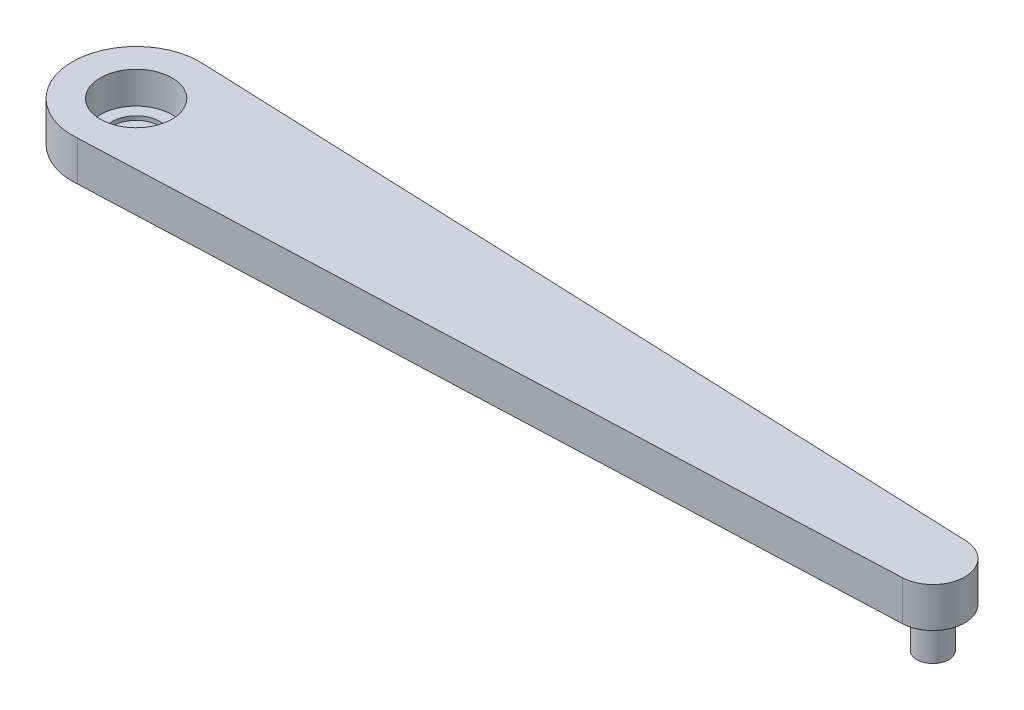
ISO-10303-21;
HEADER;
FILE_DESCRIPTION(('STEP AP214'),'2;1');
FILE_NAME('part.step','',(''),(''),'','','');
FILE_SCHEMA(('AUTOMOTIVE_DESIGN { 1 0 10303 214 1 1 1 1 }'));
ENDSEC;
DATA;
#1=APPLICATION_CONTEXT('core data for automotive mechanical design processes');
#2=APPLICATION_PROTOCOL_DEFINITION('international standard','automotive_design',2000,#1);
#3=PRODUCT_CONTEXT('',#1,'mechanical');
#4=PRODUCT('Part','Part','',(#3));
#5=PRODUCT_RELATED_PRODUCT_CATEGORY('part','',(#4));
#6=PRODUCT_DEFINITION_FORMATION('','',#4);
#7=PRODUCT_DEFINITION_CONTEXT('part definition',#1,'design');
#8=PRODUCT_DEFINITION('design','',#6,#7);
#9=PRODUCT_DEFINITION_SHAPE('','',#8);
#10=(LENGTH_UNIT() NAMED_UNIT(*) SI_UNIT(.MILLI.,.METRE.));
#11=(NAMED_UNIT(*) PLANE_ANGLE_UNIT() SI_UNIT($,.RADIAN.));
#12=(NAMED_UNIT(*) SI_UNIT($,.STERADIAN.) SOLID_ANGLE_UNIT());
#13=UNCERTAINTY_MEASURE_WITH_UNIT(LENGTH_MEASURE(1.E-05),#10,'distance_accuracy_value','');
#14=(GEOMETRIC_REPRESENTATION_CONTEXT(3) GLOBAL_UNCERTAINTY_ASSIGNED_CONTEXT((#13)) GLOBAL_UNIT_ASSIGNED_CONTEXT((#10,
#11,#12)) REPRESENTATION_CONTEXT('',''));
#15=CARTESIAN_POINT('',(0.,0.,0.));
#16=DIRECTION('',(0.,0.,1.));
#17=DIRECTION('',(1.,0.,0.));
#18=AXIS2_PLACEMENT_3D('',#15,#16,#17);
#19=CARTESIAN_POINT('',(100.,-15.,10.9999999999957));
#20=DIRECTION('',(0.,1.,6.0987171194732E-13));
#21=DIRECTION('',(0.,-6.0987171194732E-13,1.));
#22=AXIS2_PLACEMENT_3D('',#19,#20,#21);
#23=CYLINDRICAL_SURFACE('',#22,2.5);
#24=CARTESIAN_POINT('',(100.,-10.,10.9999999999987));
#25=DIRECTION('',(0.,-1.,-6.0987171194732E-13));
#26=DIRECTION('',(0.,6.0987171194732E-13,-1.));
#27=AXIS2_PLACEMENT_3D('',#24,#25,#26);
#28=CIRCLE('',#27,2.5);
#29=CARTESIAN_POINT('',(100.,-9.9999999999985,8.49999999999874));
#30=VERTEX_POINT('',#29);
#31=EDGE_CURVE('E164',#30,#30,#28,.T.);
#32=ORIENTED_EDGE('',*,*,#31,.T.);
#33=EDGE_LOOP('',(#32));
#34=FACE_BOUND('',#33,.T.);
#35=CARTESIAN_POINT('',(100.,-11.,10.9999999999981));
#36=DIRECTION('',(0.,-1.,-6.0987171194732E-13));
#37=DIRECTION('',(0.,6.0987171194732E-13,-1.));
#38=AXIS2_PLACEMENT_3D('',#35,#36,#37);
#39=CIRCLE('',#38,2.49999999999999);
#40=CARTESIAN_POINT('',(100.,-10.9999999999985,8.49999999999813));
#41=VERTEX_POINT('',#40);
#42=EDGE_CURVE('E168',#41,#41,#39,.T.);
#43=ORIENTED_EDGE('',*,*,#42,.F.);
#44=EDGE_LOOP('',(#43));
#45=FACE_BOUND('',#44,.T.);
#46=ADVANCED_FACE('F34',(#34,#45),#23,.T.);
#47=CARTESIAN_POINT('',(0.638194142527764,-9.99999999999516,3.02550068589248));
#48=DIRECTION('',(-0.0399189739987593,-6.09385595457592E-13,0.999202920089251));
#49=DIRECTION('',(-0.999202920089251,0.,-0.0399189739987593));
#50=AXIS2_PLACEMENT_3D('',#47,#48,#49);
#51=PLANE('',#50);
#52=DIRECTION('',(0.999202920089251,0.,0.0399189739987593));
#53=VECTOR('',#52,1.);
#54=CARTESIAN_POINT('',(0.638194142527764,-4.99999999999516,3.02550068589552));
#55=LINE('',#54,#53);
#56=CARTESIAN_POINT('',(0.638194142527761,-4.99999999999516,3.02550068589552));
#57=VERTEX_POINT('',#56);
#58=CARTESIAN_POINT('',(100.159744622753,-4.99999999999758,7.00146803553201));
#59=VERTEX_POINT('',#58);
#60=EDGE_CURVE('E97',#57,#59,#55,.T.);
#61=ORIENTED_EDGE('',*,*,#60,.T.);
#62=DIRECTION('',(0.,1.,6.0987171194732E-13));
#63=VECTOR('',#62,1.);
#64=CARTESIAN_POINT('',(100.159744622753,-9.99999999999758,7.00146803552896));
#65=LINE('',#64,#63);
#66=CARTESIAN_POINT('',(100.159744622753,-9.99999999999758,7.00146803552896));
#67=VERTEX_POINT('',#66);
#68=EDGE_CURVE('E11',#67,#59,#65,.T.);
#69=ORIENTED_EDGE('',*,*,#68,.F.);
#70=DIRECTION('',(0.999202920089251,0.,0.0399189739987593));
#71=VECTOR('',#70,1.);
#72=CARTESIAN_POINT('',(0.638194142527764,-9.99999999999516,3.02550068589248));
#73=LINE('',#72,#71);
#74=CARTESIAN_POINT('',(0.638194142527761,-9.99999999999516,3.02550068589248));
#75=VERTEX_POINT('',#74);
#76=EDGE_CURVE('E82',#75,#67,#73,.T.);
#77=ORIENTED_EDGE('',*,*,#76,.F.);
#78=DIRECTION('',(0.,1.,6.0987171194732E-13));
#79=VECTOR('',#78,1.);
#80=CARTESIAN_POINT('',(0.638194142527761,-9.99999999999516,3.02550068589248));
#81=LINE('',#80,#79);
#82=EDGE_CURVE('E93',#75,#57,#81,.T.);
#83=ORIENTED_EDGE('',*,*,#82,.T.);
#84=EDGE_LOOP('',(#61,#69,#77,#83));
#85=FACE_BOUND('',#84,.T.);
#86=ADVANCED_FACE('F36',(#85),#51,.F.);
#87=CARTESIAN_POINT('',(100.,-10.,10.9999999999987));
#88=DIRECTION('',(0.,1.,6.0987171194732E-13));
#89=DIRECTION('',(-1.,0.,0.));
#90=AXIS2_PLACEMENT_3D('',#87,#88,#89);
#91=CYLINDRICAL_SURFACE('',#90,4.00172165641051);
#92=CARTESIAN_POINT('',(100.,-5.00000000000002,11.0000000000018));
#93=DIRECTION('',(0.,-1.,-6.0987171194732E-13));
#94=DIRECTION('',(1.,0.,0.));
#95=AXIS2_PLACEMENT_3D('',#92,#93,#94);
#96=CIRCLE('',#95,4.00172165641051);
#97=CARTESIAN_POINT('',(100.159744622753,-5.00000000000246,14.9985319644716));
#98=VERTEX_POINT('',#97);
#99=EDGE_CURVE('E87',#59,#98,#96,.T.);
#100=ORIENTED_EDGE('',*,*,#99,.T.);
#101=DIRECTION('',(0.,1.,6.0987171194732E-13));
#102=VECTOR('',#101,1.);
#103=CARTESIAN_POINT('',(100.159744622753,-10.0000000000025,14.9985319644685));
#104=LINE('',#103,#102);
#105=CARTESIAN_POINT('',(100.159744622753,-10.0000000000025,14.9985319644685));
#106=VERTEX_POINT('',#105);
#107=EDGE_CURVE('E43',#106,#98,#104,.T.);
#108=ORIENTED_EDGE('',*,*,#107,.F.);
#109=CARTESIAN_POINT('',(100.,-10.,10.9999999999987));
#110=DIRECTION('',(0.,-1.,-6.0987171194732E-13));
#111=DIRECTION('',(1.,0.,0.));
#112=AXIS2_PLACEMENT_3D('',#109,#110,#111);
#113=CIRCLE('',#112,4.00172165641051);
#114=EDGE_CURVE('E77',#67,#106,#113,.T.);
#115=ORIENTED_EDGE('',*,*,#114,.F.);
#116=ORIENTED_EDGE('',*,*,#68,.T.);
#117=EDGE_LOOP('',(#100,#108,#115,#116));
#118=FACE_BOUND('',#117,.T.);
#119=ADVANCED_FACE('F86',(#118),#91,.T.);
#120=CARTESIAN_POINT('',(0.638194142527764,-10.0000000000049,18.974499314105));
#121=DIRECTION('',(0.0399189739987593,-6.09385595457592E-13,0.999202920089251));
#122=DIRECTION('',(-0.999202920089251,0.,0.0399189739987593));
#123=AXIS2_PLACEMENT_3D('',#120,#121,#122);
#124=PLANE('',#123);
#125=DIRECTION('',(0.999202920089251,0.,-0.0399189739987593));
#126=VECTOR('',#125,1.);
#127=CARTESIAN_POINT('',(0.638194142527764,-5.00000000000489,18.9744993141081));
#128=LINE('',#127,#126);
#129=CARTESIAN_POINT('',(0.638194142527764,-5.00000000000489,18.9744993141081));
#130=VERTEX_POINT('',#129);
#131=EDGE_CURVE('E102',#130,#98,#128,.T.);
#132=ORIENTED_EDGE('',*,*,#131,.F.);
#133=DIRECTION('',(0.,1.,6.0987171194732E-13));
#134=VECTOR('',#133,1.);
#135=CARTESIAN_POINT('',(0.638194142527764,-10.0000000000049,18.974499314105));
#136=LINE('',#135,#134);
#137=CARTESIAN_POINT('',(0.638194142527764,-10.0000000000049,18.974499314105));
#138=VERTEX_POINT('',#137);
#139=EDGE_CURVE('E67',#138,#130,#136,.T.);
#140=ORIENTED_EDGE('',*,*,#139,.F.);
#141=DIRECTION('',(0.999202920089251,0.,-0.0399189739987593));
#142=VECTOR('',#141,1.);
#143=CARTESIAN_POINT('',(0.638194142527764,-10.0000000000049,18.974499314105));
#144=LINE('',#143,#142);
#145=EDGE_CURVE('E80',#138,#106,#144,.T.);
#146=ORIENTED_EDGE('',*,*,#145,.T.);
#147=ORIENTED_EDGE('',*,*,#107,.T.);
#148=EDGE_LOOP('',(#132,#140,#146,#147));
#149=FACE_BOUND('',#148,.T.);
#150=ADVANCED_FACE('F91',(#149),#124,.T.);
#151=CARTESIAN_POINT('',(0.,-10.,10.9999999999987));
#152=DIRECTION('',(0.,1.,6.0987171194732E-13));
#153=DIRECTION('',(-1.,0.,0.));
#154=AXIS2_PLACEMENT_3D('',#151,#152,#153);
#155=CYLINDRICAL_SURFACE('',#154,7.99999569213872);
#156=CARTESIAN_POINT('',(0.,-5.00000000000002,11.0000000000018));
#157=DIRECTION('',(0.,-1.,-6.0987171194732E-13));
#158=DIRECTION('',(1.,0.,0.));
#159=AXIS2_PLACEMENT_3D('',#156,#157,#158);
#160=CIRCLE('',#159,7.99999569213872);
#161=EDGE_CURVE('E70',#130,#57,#160,.T.);
#162=ORIENTED_EDGE('',*,*,#161,.T.);
#163=ORIENTED_EDGE('',*,*,#82,.F.);
#164=CARTESIAN_POINT('',(0.,-10.,10.9999999999987));
#165=DIRECTION('',(0.,-1.,-6.0987171194732E-13));
#166=DIRECTION('',(1.,0.,0.));
#167=AXIS2_PLACEMENT_3D('',#164,#165,#166);
#168=CIRCLE('',#167,7.99999569213872);
#169=EDGE_CURVE('E51',#138,#75,#168,.T.);
#170=ORIENTED_EDGE('',*,*,#169,.F.);
#171=ORIENTED_EDGE('',*,*,#139,.T.);
#172=EDGE_LOOP('',(#162,#163,#170,#171));
#173=FACE_BOUND('',#172,.T.);
#174=ADVANCED_FACE('F121',(#173),#155,.T.);
#175=CARTESIAN_POINT('',(100.,-10.,10.9999999999987));
#176=DIRECTION('',(0.,-1.,-6.0987171194732E-13));
#177=DIRECTION('',(1.,0.,0.));
#178=AXIS2_PLACEMENT_3D('',#175,#176,#177);
#179=PLANE('',#178);
#180=ORIENTED_EDGE('',*,*,#31,.F.);
#181=EDGE_LOOP('',(#180));
#182=FACE_BOUND('',#181,.T.);
#183=ORIENTED_EDGE('',*,*,#76,.T.);
#184=ORIENTED_EDGE('',*,*,#114,.T.);
#185=ORIENTED_EDGE('',*,*,#145,.F.);
#186=ORIENTED_EDGE('',*,*,#169,.T.);
#187=EDGE_LOOP('',(#183,#184,#185,#186));
#188=FACE_BOUND('',#187,.T.);
#189=ADVANCED_FACE('F78',(#182,#188),#179,.T.);
#190=CARTESIAN_POINT('',(100.,-5.00000000000002,11.0000000000018));
#191=DIRECTION('',(0.,-1.,-6.0987171194732E-13));
#192=DIRECTION('',(1.,0.,0.));
#193=AXIS2_PLACEMENT_3D('',#190,#191,#192);
#194=PLANE('',#193);
#195=CARTESIAN_POINT('',(0.,-5.00000000000002,11.0000000000018));
#196=DIRECTION('',(0.,1.,6.0987171194732E-13));
#197=DIRECTION('',(-1.,0.,0.));
#198=AXIS2_PLACEMENT_3D('',#195,#196,#197);
#199=CIRCLE('',#198,4.5);
#200=CARTESIAN_POINT('',(-4.5,-5.00000000000002,11.0000000000018));
#201=VERTEX_POINT('',#200);
#202=EDGE_CURVE('E157',#201,#201,#199,.T.);
#203=ORIENTED_EDGE('',*,*,#202,.F.);
#204=EDGE_LOOP('',(#203));
#205=FACE_BOUND('',#204,.T.);
#206=ORIENTED_EDGE('',*,*,#60,.F.);
#207=ORIENTED_EDGE('',*,*,#161,.F.);
#208=ORIENTED_EDGE('',*,*,#131,.T.);
#209=ORIENTED_EDGE('',*,*,#99,.F.);
#210=EDGE_LOOP('',(#206,#207,#208,#209));
#211=FACE_BOUND('',#210,.T.);
#212=ADVANCED_FACE('F109',(#205,#211),#194,.F.);
#213=CARTESIAN_POINT('',(0.,-9.00000000000002,10.9999999999993));
#214=DIRECTION('',(0.,1.,6.0987171194732E-13));
#215=DIRECTION('',(-1.,0.,0.));
#216=AXIS2_PLACEMENT_3D('',#213,#214,#215);
#217=CYLINDRICAL_SURFACE('',#216,4.5);
#218=CARTESIAN_POINT('',(0.,-9.00000000000002,10.9999999999993));
#219=DIRECTION('',(0.,1.,6.0987171194732E-13));
#220=DIRECTION('',(-1.,0.,0.));
#221=AXIS2_PLACEMENT_3D('',#218,#219,#220);
#222=CIRCLE('',#221,4.5);
#223=CARTESIAN_POINT('',(-4.5,-9.00000000000002,10.9999999999993));
#224=VERTEX_POINT('',#223);
#225=EDGE_CURVE('E100',#224,#224,#222,.T.);
#226=CARTESIAN_POINT('',(-4.5,-9.00000000000002,10.9999999999993));
#227=CARTESIAN_POINT('',(-4.5,-8.95833333333336,10.9999999999994));
#228=CARTESIAN_POINT('',(-4.5,-8.91666666666669,10.9999999999994));
#229=CARTESIAN_POINT('',(-4.5,-8.83333333333336,10.9999999999994));
#230=CARTESIAN_POINT('',(-4.5,-8.79166666666669,10.9999999999995));
#231=CARTESIAN_POINT('',(-4.5,-8.70833333333336,10.9999999999995));
#232=CARTESIAN_POINT('',(-4.5,-8.66666666666669,10.9999999999996));
#233=CARTESIAN_POINT('',(-4.5,-8.58333333333336,10.9999999999996));
#234=CARTESIAN_POINT('',(-4.5,-8.54166666666669,10.9999999999996));
#235=CARTESIAN_POINT('',(-4.5,-8.45833333333336,10.9999999999997));
#236=CARTESIAN_POINT('',(-4.5,-8.41666666666669,10.9999999999997));
#237=CARTESIAN_POINT('',(-4.5,-8.33333333333336,10.9999999999998));
#238=CARTESIAN_POINT('',(-4.5,-8.29166666666669,10.9999999999998));
#239=CARTESIAN_POINT('',(-4.5,-8.20833333333336,10.9999999999998));
#240=CARTESIAN_POINT('',(-4.5,-8.16666666666669,10.9999999999999));
#241=CARTESIAN_POINT('',(-4.5,-8.08333333333336,10.9999999999999));
#242=CARTESIAN_POINT('',(-4.5,-8.04166666666669,10.9999999999999));
#243=CARTESIAN_POINT('',(-4.5,-7.95833333333336,11.));
#244=CARTESIAN_POINT('',(-4.5,-7.91666666666669,11.));
#245=CARTESIAN_POINT('',(-4.5,-7.83333333333336,11.0000000000001));
#246=CARTESIAN_POINT('',(-4.5,-7.79166666666669,11.0000000000001));
#247=CARTESIAN_POINT('',(-4.5,-7.70833333333336,11.0000000000001));
#248=CARTESIAN_POINT('',(-4.5,-7.66666666666669,11.0000000000002));
#249=CARTESIAN_POINT('',(-4.5,-7.58333333333336,11.0000000000002));
#250=CARTESIAN_POINT('',(-4.5,-7.54166666666669,11.0000000000002));
#251=CARTESIAN_POINT('',(-4.5,-7.45833333333336,11.0000000000003));
#252=CARTESIAN_POINT('',(-4.5,-7.41666666666669,11.0000000000003));
#253=CARTESIAN_POINT('',(-4.5,-7.33333333333336,11.0000000000004));
#254=CARTESIAN_POINT('',(-4.5,-7.29166666666669,11.0000000000004));
#255=CARTESIAN_POINT('',(-4.5,-7.20833333333336,11.0000000000004));
#256=CARTESIAN_POINT('',(-4.5,-7.16666666666669,11.0000000000005));
#257=CARTESIAN_POINT('',(-4.5,-7.08333333333336,11.0000000000005));
#258=CARTESIAN_POINT('',(-4.5,-7.04166666666669,11.0000000000005));
#259=CARTESIAN_POINT('',(-4.5,-6.95833333333336,11.0000000000006));
#260=CARTESIAN_POINT('',(-4.5,-6.91666666666669,11.0000000000006));
#261=CARTESIAN_POINT('',(-4.5,-6.83333333333336,11.0000000000007));
#262=CARTESIAN_POINT('',(-4.5,-6.79166666666669,11.0000000000007));
#263=CARTESIAN_POINT('',(-4.5,-6.70833333333336,11.0000000000007));
#264=CARTESIAN_POINT('',(-4.5,-6.66666666666669,11.0000000000008));
#265=CARTESIAN_POINT('',(-4.5,-6.58333333333336,11.0000000000008));
#266=CARTESIAN_POINT('',(-4.5,-6.54166666666669,11.0000000000008));
#267=CARTESIAN_POINT('',(-4.5,-6.45833333333336,11.0000000000009));
#268=CARTESIAN_POINT('',(-4.5,-6.41666666666669,11.0000000000009));
#269=CARTESIAN_POINT('',(-4.5,-6.33333333333336,11.000000000001));
#270=CARTESIAN_POINT('',(-4.5,-6.29166666666669,11.000000000001));
#271=CARTESIAN_POINT('',(-4.5,-6.20833333333336,11.000000000001));
#272=CARTESIAN_POINT('',(-4.5,-6.16666666666669,11.0000000000011));
#273=CARTESIAN_POINT('',(-4.5,-6.08333333333336,11.0000000000011));
#274=CARTESIAN_POINT('',(-4.5,-6.04166666666669,11.0000000000012));
#275=CARTESIAN_POINT('',(-4.5,-5.95833333333336,11.0000000000012));
#276=CARTESIAN_POINT('',(-4.5,-5.91666666666669,11.0000000000012));
#277=CARTESIAN_POINT('',(-4.5,-5.83333333333336,11.0000000000013));
#278=CARTESIAN_POINT('',(-4.5,-5.79166666666669,11.0000000000013));
#279=CARTESIAN_POINT('',(-4.5,-5.70833333333336,11.0000000000014));
#280=CARTESIAN_POINT('',(-4.5,-5.66666666666669,11.0000000000014));
#281=CARTESIAN_POINT('',(-4.5,-5.58333333333336,11.0000000000014));
#282=CARTESIAN_POINT('',(-4.5,-5.54166666666669,11.0000000000015));
#283=CARTESIAN_POINT('',(-4.5,-5.45833333333336,11.0000000000015));
#284=CARTESIAN_POINT('',(-4.5,-5.41666666666669,11.0000000000015));
#285=CARTESIAN_POINT('',(-4.5,-5.33333333333336,11.0000000000016));
#286=CARTESIAN_POINT('',(-4.5,-5.29166666666669,11.0000000000016));
#287=CARTESIAN_POINT('',(-4.5,-5.20833333333336,11.0000000000017));
#288=CARTESIAN_POINT('',(-4.5,-5.16666666666669,11.0000000000017));
#289=CARTESIAN_POINT('',(-4.5,-5.08333333333336,11.0000000000017));
#290=CARTESIAN_POINT('',(-4.5,-5.04166666666669,11.0000000000018));
#291=CARTESIAN_POINT('',(-4.5,-5.00000000000002,11.0000000000018));
#292=B_SPLINE_CURVE_WITH_KNOTS('',3,(#226,#227,#228,#229,#230,#231,#232,#233,#234,#235,#236,
#237,#238,#239,#240,#241,#242,#243,#244,#245,#246,#247,#248,#249,#250,#251,#252,#253,#254,#255,
#256,#257,#258,#259,#260,#261,#262,#263,#264,#265,#266,#267,#268,#269,#270,#271,#272,#273,#274,
#275,#276,#277,#278,#279,#280,#281,#282,#283,#284,#285,#286,#287,#288,#289,#290,#291),
.UNSPECIFIED.,.F.,.F.,(4,2,2,2,2,2,2,2,2,2,2,2,2,2,2,2,2,2,2,2,2,2,2,2,2,2,2,2,2,2,2,2,4),(0.,
0.124999999999998,0.249999999999999,0.374999999999999,0.499999999999999,0.624999999999999,
0.749999999999999,0.874999999999999,0.999999999999999,1.125,1.25,1.375,1.5,1.625,1.75,1.875,2.,
2.125,2.25,2.375,2.5,2.625,2.75,2.875,3.,3.125,3.25,3.375,3.5,3.625,3.75,3.875,4.),.UNSPECIFIED.);
#293=EDGE_CURVE('BSEAM111',#224,#201,#292,.T.);
#294=ORIENTED_EDGE('',*,*,#225,.F.);
#295=ORIENTED_EDGE('',*,*,#202,.T.);
#296=ORIENTED_EDGE('',*,*,#293,.T.);
#297=ORIENTED_EDGE('',*,*,#293,.F.);
#298=EDGE_LOOP('',(#294,#296,#295,#297));
#299=FACE_BOUND('',#298,.T.);
#300=ADVANCED_FACE('F111',(#299),#217,.F.);
#301=CARTESIAN_POINT('',(0.,-9.00000000000002,10.9999999999993));
#302=DIRECTION('',(0.,1.,6.0987171194732E-13));
#303=DIRECTION('',(-1.,0.,0.));
#304=AXIS2_PLACEMENT_3D('',#301,#302,#303);
#305=PLANE('',#304);
#306=CARTESIAN_POINT('',(0.,-9.00000000000002,10.9999999999993));
#307=DIRECTION('',(0.,1.,6.0987171194732E-13));
#308=DIRECTION('',(-1.,0.,0.));
#309=AXIS2_PLACEMENT_3D('',#306,#307,#308);
#310=CIRCLE('',#309,3.);
#311=CARTESIAN_POINT('',(-3.,-9.00000000000002,10.9999999999993));
#312=VERTEX_POINT('',#311);
#313=EDGE_CURVE('E154',#312,#312,#310,.T.);
#314=ORIENTED_EDGE('',*,*,#313,.F.);
#315=EDGE_LOOP('',(#314));
#316=FACE_BOUND('',#315,.T.);
#317=ORIENTED_EDGE('',*,*,#225,.T.);
#318=EDGE_LOOP('',(#317));
#319=FACE_BOUND('',#318,.T.);
#320=ADVANCED_FACE('F118',(#316,#319),#305,.T.);
#321=CARTESIAN_POINT('',(0.,-9.50000000000002,10.999999999999));
#322=DIRECTION('',(0.,1.,6.0987171194732E-13));
#323=DIRECTION('',(-1.,0.,0.));
#324=AXIS2_PLACEMENT_3D('',#321,#322,#323);
#325=CYLINDRICAL_SURFACE('',#324,3.);
#326=CARTESIAN_POINT('',(0.,-9.50000000000002,10.999999999999));
#327=DIRECTION('',(0.,1.,6.0987171194732E-13));
#328=DIRECTION('',(-1.,0.,0.));
#329=AXIS2_PLACEMENT_3D('',#326,#327,#328);
#330=CIRCLE('',#329,3.);
#331=CARTESIAN_POINT('',(-3.,-9.50000000000002,10.999999999999));
#332=VERTEX_POINT('',#331);
#333=EDGE_CURVE('E160',#332,#332,#330,.T.);
#334=CARTESIAN_POINT('',(-3.,-9.50000000000002,10.999999999999));
#335=CARTESIAN_POINT('',(-3.,-9.49479166666669,10.999999999999));
#336=CARTESIAN_POINT('',(-3.,-9.48958333333336,10.999999999999));
#337=CARTESIAN_POINT('',(-3.,-9.47916666666669,10.9999999999991));
#338=CARTESIAN_POINT('',(-3.,-9.47395833333336,10.9999999999991));
#339=CARTESIAN_POINT('',(-3.,-9.46354166666669,10.9999999999991));
#340=CARTESIAN_POINT('',(-3.,-9.45833333333336,10.9999999999991));
#341=CARTESIAN_POINT('',(-3.,-9.44791666666669,10.9999999999991));
#342=CARTESIAN_POINT('',(-3.,-9.44270833333336,10.9999999999991));
#343=CARTESIAN_POINT('',(-3.,-9.43229166666669,10.9999999999991));
#344=CARTESIAN_POINT('',(-3.,-9.42708333333336,10.9999999999991));
#345=CARTESIAN_POINT('',(-3.,-9.41666666666669,10.9999999999991));
#346=CARTESIAN_POINT('',(-3.,-9.41145833333336,10.9999999999991));
#347=CARTESIAN_POINT('',(-3.,-9.40104166666669,10.9999999999991));
#348=CARTESIAN_POINT('',(-3.,-9.39583333333336,10.9999999999991));
#349=CARTESIAN_POINT('',(-3.,-9.38541666666669,10.9999999999991));
#350=CARTESIAN_POINT('',(-3.,-9.38020833333336,10.9999999999991));
#351=CARTESIAN_POINT('',(-3.,-9.36979166666669,10.9999999999991));
#352=CARTESIAN_POINT('',(-3.,-9.36458333333336,10.9999999999991));
#353=CARTESIAN_POINT('',(-3.,-9.35416666666669,10.9999999999991));
#354=CARTESIAN_POINT('',(-3.,-9.34895833333336,10.9999999999991));
#355=CARTESIAN_POINT('',(-3.,-9.33854166666669,10.9999999999991));
#356=CARTESIAN_POINT('',(-3.,-9.33333333333336,10.9999999999991));
#357=CARTESIAN_POINT('',(-3.,-9.32291666666669,10.9999999999991));
#358=CARTESIAN_POINT('',(-3.,-9.31770833333336,10.9999999999992));
#359=CARTESIAN_POINT('',(-3.,-9.30729166666669,10.9999999999992));
#360=CARTESIAN_POINT('',(-3.,-9.30208333333336,10.9999999999992));
#361=CARTESIAN_POINT('',(-3.,-9.29166666666669,10.9999999999992));
#362=CARTESIAN_POINT('',(-3.,-9.28645833333336,10.9999999999992));
#363=CARTESIAN_POINT('',(-3.,-9.27604166666669,10.9999999999992));
#364=CARTESIAN_POINT('',(-3.,-9.27083333333336,10.9999999999992));
#365=CARTESIAN_POINT('',(-3.,-9.26041666666669,10.9999999999992));
#366=CARTESIAN_POINT('',(-3.,-9.25520833333336,10.9999999999992));
#367=CARTESIAN_POINT('',(-3.,-9.24479166666669,10.9999999999992));
#368=CARTESIAN_POINT('',(-3.,-9.23958333333336,10.9999999999992));
#369=CARTESIAN_POINT('',(-3.,-9.22916666666669,10.9999999999992));
#370=CARTESIAN_POINT('',(-3.,-9.22395833333336,10.9999999999992));
#371=CARTESIAN_POINT('',(-3.,-9.21354166666669,10.9999999999992));
#372=CARTESIAN_POINT('',(-3.,-9.20833333333336,10.9999999999992));
#373=CARTESIAN_POINT('',(-3.,-9.19791666666669,10.9999999999992));
#374=CARTESIAN_POINT('',(-3.,-9.19270833333336,10.9999999999992));
#375=CARTESIAN_POINT('',(-3.,-9.18229166666669,10.9999999999992));
#376=CARTESIAN_POINT('',(-3.,-9.17708333333336,10.9999999999992));
#377=CARTESIAN_POINT('',(-3.,-9.16666666666669,10.9999999999992));
#378=CARTESIAN_POINT('',(-3.,-9.16145833333336,10.9999999999992));
#379=CARTESIAN_POINT('',(-3.,-9.15104166666669,10.9999999999993));
#380=CARTESIAN_POINT('',(-3.,-9.14583333333336,10.9999999999993));
#381=CARTESIAN_POINT('',(-3.,-9.13541666666669,10.9999999999993));
#382=CARTESIAN_POINT('',(-3.,-9.13020833333336,10.9999999999993));
#383=CARTESIAN_POINT('',(-3.,-9.11979166666669,10.9999999999993));
#384=CARTESIAN_POINT('',(-3.,-9.11458333333336,10.9999999999993));
#385=CARTESIAN_POINT('',(-3.,-9.10416666666669,10.9999999999993));
#386=CARTESIAN_POINT('',(-3.,-9.09895833333336,10.9999999999993));
#387=CARTESIAN_POINT('',(-3.,-9.08854166666669,10.9999999999993));
#388=CARTESIAN_POINT('',(-3.,-9.08333333333336,10.9999999999993));
#389=CARTESIAN_POINT('',(-3.,-9.07291666666669,10.9999999999993));
#390=CARTESIAN_POINT('',(-3.,-9.06770833333336,10.9999999999993));
#391=CARTESIAN_POINT('',(-3.,-9.05729166666669,10.9999999999993));
#392=CARTESIAN_POINT('',(-3.,-9.05208333333336,10.9999999999993));
#393=CARTESIAN_POINT('',(-3.,-9.04166666666669,10.9999999999993));
#394=CARTESIAN_POINT('',(-3.,-9.03645833333336,10.9999999999993));
#395=CARTESIAN_POINT('',(-3.,-9.02604166666669,10.9999999999993));
#396=CARTESIAN_POINT('',(-3.,-9.02083333333336,10.9999999999993));
#397=CARTESIAN_POINT('',(-3.,-9.01041666666669,10.9999999999993));
#398=CARTESIAN_POINT('',(-3.,-9.00520833333336,10.9999999999993));
#399=CARTESIAN_POINT('',(-3.,-9.00000000000002,10.9999999999993));
#400=B_SPLINE_CURVE_WITH_KNOTS('',3,(#334,#335,#336,#337,#338,#339,#340,#341,#342,#343,#344,
#345,#346,#347,#348,#349,#350,#351,#352,#353,#354,#355,#356,#357,#358,#359,#360,#361,#362,#363,
#364,#365,#366,#367,#368,#369,#370,#371,#372,#373,#374,#375,#376,#377,#378,#379,#380,#381,#382,
#383,#384,#385,#386,#387,#388,#389,#390,#391,#392,#393,#394,#395,#396,#397,#398,#399),
.UNSPECIFIED.,.F.,.F.,(4,2,2,2,2,2,2,2,2,2,2,2,2,2,2,2,2,2,2,2,2,2,2,2,2,2,2,2,2,2,2,2,4),(0.,
0.0156249999999983,0.0312499999999983,0.0468749999999983,0.0624999999999983,0.0781249999999983,
0.0937499999999983,0.109374999999998,0.124999999999998,0.140624999999998,0.156249999999998,
0.171874999999998,0.187499999999998,0.203124999999998,0.218749999999998,0.234374999999998,
0.249999999999999,0.265624999999999,0.281249999999999,0.296874999999999,0.312499999999999,
0.328124999999999,0.343749999999999,0.359374999999999,0.374999999999999,0.390624999999999,
0.406249999999999,0.421874999999999,0.437499999999999,0.453124999999999,0.468749999999999,
0.484374999999999,0.499999999999999),.UNSPECIFIED.);
#401=EDGE_CURVE('BSEAM142',#332,#312,#400,.T.);
#402=ORIENTED_EDGE('',*,*,#333,.F.);
#403=ORIENTED_EDGE('',*,*,#313,.T.);
#404=ORIENTED_EDGE('',*,*,#401,.T.);
#405=ORIENTED_EDGE('',*,*,#401,.F.);
#406=EDGE_LOOP('',(#402,#404,#403,#405));
#407=FACE_BOUND('',#406,.T.);
#408=ADVANCED_FACE('F142',(#407),#325,.F.);
#409=CARTESIAN_POINT('',(0.,-9.50000000000002,10.999999999999));
#410=DIRECTION('',(0.,1.,6.0987171194732E-13));
#411=DIRECTION('',(-1.,0.,0.));
#412=AXIS2_PLACEMENT_3D('',#409,#410,#411);
#413=PLANE('',#412);
#414=ORIENTED_EDGE('',*,*,#333,.T.);
#415=EDGE_LOOP('',(#414));
#416=FACE_BOUND('',#415,.T.);
#417=ADVANCED_FACE('F138',(#416),#413,.T.);
#418=CARTESIAN_POINT('',(100.,-11.,10.9999999999981));
#419=DIRECTION('',(0.,-1.,-6.0987171194732E-13));
#420=DIRECTION('',(0.,6.0987171194732E-13,-1.));
#421=AXIS2_PLACEMENT_3D('',#418,#419,#420);
#422=PLANE('',#421);
#423=CARTESIAN_POINT('',(100.,-11.,10.9999999999981));
#424=DIRECTION('',(0.,-1.,-6.0987171194732E-13));
#425=DIRECTION('',(0.,6.0987171194732E-13,-1.));
#426=AXIS2_PLACEMENT_3D('',#423,#424,#425);
#427=CIRCLE('',#426,2.);
#428=CARTESIAN_POINT('',(100.,-10.9999999999988,8.99999999999813));
#429=VERTEX_POINT('',#428);
#430=EDGE_CURVE('E171',#429,#429,#427,.T.);
#431=ORIENTED_EDGE('',*,*,#430,.F.);
#432=EDGE_LOOP('',(#431));
#433=FACE_BOUND('',#432,.T.);
#434=ORIENTED_EDGE('',*,*,#42,.T.);
#435=EDGE_LOOP('',(#434));
#436=FACE_BOUND('',#435,.T.);
#437=ADVANCED_FACE('F141',(#433,#436),#422,.T.);
#438=CARTESIAN_POINT('',(100.,-11.,10.9999999999981));
#439=DIRECTION('',(0.,-1.,-6.0987171194732E-13));
#440=DIRECTION('',(0.,6.0987171194732E-13,-1.));
#441=AXIS2_PLACEMENT_3D('',#438,#439,#440);
#442=CYLINDRICAL_SURFACE('',#441,2.);
#443=ORIENTED_EDGE('',*,*,#430,.T.);
#444=EDGE_LOOP('',(#443));
#445=FACE_BOUND('',#444,.T.);
#446=CARTESIAN_POINT('',(100.,-15.,10.9999999999957));
#447=DIRECTION('',(0.,-1.,-6.0987171194732E-13));
#448=DIRECTION('',(0.,6.0987171194732E-13,-1.));
#449=AXIS2_PLACEMENT_3D('',#446,#447,#448);
#450=CIRCLE('',#449,2.);
#451=CARTESIAN_POINT('',(100.,-14.9999999999988,8.99999999999569));
#452=VERTEX_POINT('',#451);
#453=EDGE_CURVE('E172',#452,#452,#450,.T.);
#454=ORIENTED_EDGE('',*,*,#453,.F.);
#455=EDGE_LOOP('',(#454));
#456=FACE_BOUND('',#455,.T.);
#457=ADVANCED_FACE('F178',(#445,#456),#442,.T.);
#458=CARTESIAN_POINT('',(100.,-15.,10.9999999999957));
#459=DIRECTION('',(0.,-1.,-6.0987171194732E-13));
#460=DIRECTION('',(0.,6.0987171194732E-13,-1.));
#461=AXIS2_PLACEMENT_3D('',#458,#459,#460);
#462=PLANE('',#461);
#463=ORIENTED_EDGE('',*,*,#453,.T.);
#464=EDGE_LOOP('',(#463));
#465=FACE_BOUND('',#464,.T.);
#466=ADVANCED_FACE('F136',(#465),#462,.T.);
#467=CLOSED_SHELL('',(#46,#86,#119,#150,#174,#189,#212,#300,#320,#408,#417,#437,#457,#466));
#468=MANIFOLD_SOLID_BREP('B2',#467);
#469=ADVANCED_BREP_SHAPE_REPRESENTATION('',(#18,#468),#14);
#470=SHAPE_DEFINITION_REPRESENTATION(#9,#469);
ENDSEC;
END-ISO-10303-21;
